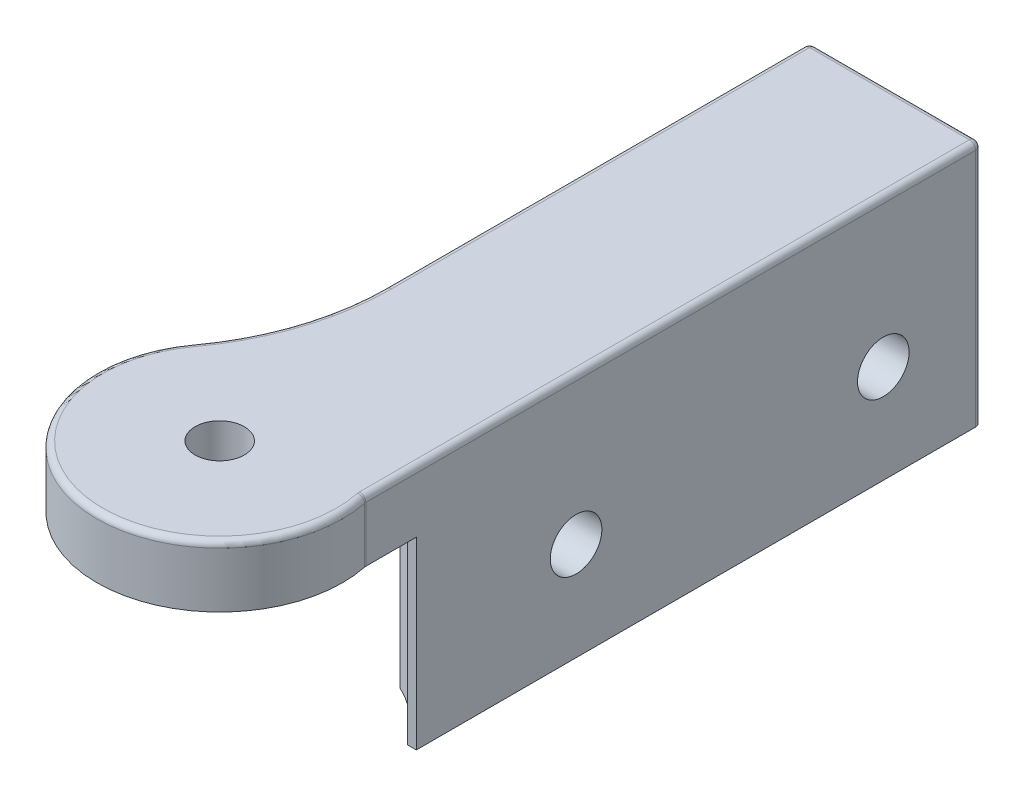
ISO-10303-21;
HEADER;
FILE_DESCRIPTION(('STEP AP214'),'2;1');
FILE_NAME('part.step','',(''),(''),'','','');
FILE_SCHEMA(('AUTOMOTIVE_DESIGN { 1 0 10303 214 1 1 1 1 }'));
ENDSEC;
DATA;
#1=APPLICATION_CONTEXT('core data for automotive mechanical design processes');
#2=APPLICATION_PROTOCOL_DEFINITION('international standard','automotive_design',2000,#1);
#3=PRODUCT_CONTEXT('',#1,'mechanical');
#4=PRODUCT('Part','Part','',(#3));
#5=PRODUCT_RELATED_PRODUCT_CATEGORY('part','',(#4));
#6=PRODUCT_DEFINITION_FORMATION('','',#4);
#7=PRODUCT_DEFINITION_CONTEXT('part definition',#1,'design');
#8=PRODUCT_DEFINITION('design','',#6,#7);
#9=PRODUCT_DEFINITION_SHAPE('','',#8);
#10=(LENGTH_UNIT() NAMED_UNIT(*) SI_UNIT(.MILLI.,.METRE.));
#11=(NAMED_UNIT(*) PLANE_ANGLE_UNIT() SI_UNIT($,.RADIAN.));
#12=(NAMED_UNIT(*) SI_UNIT($,.STERADIAN.) SOLID_ANGLE_UNIT());
#13=UNCERTAINTY_MEASURE_WITH_UNIT(LENGTH_MEASURE(1.E-05),#10,'distance_accuracy_value','');
#14=(GEOMETRIC_REPRESENTATION_CONTEXT(3) GLOBAL_UNCERTAINTY_ASSIGNED_CONTEXT((#13)) GLOBAL_UNIT_ASSIGNED_CONTEXT((#10,
#11,#12)) REPRESENTATION_CONTEXT('',''));
#15=CARTESIAN_POINT('',(0.,0.,0.));
#16=DIRECTION('',(0.,0.,1.));
#17=DIRECTION('',(1.,0.,0.));
#18=AXIS2_PLACEMENT_3D('',#15,#16,#17);
#19=CARTESIAN_POINT('',(31.,-46.2709412050371,15.));
#20=DIRECTION('',(0.,0.,-1.));
#21=DIRECTION('',(-1.,0.,0.));
#22=AXIS2_PLACEMENT_3D('',#19,#20,#21);
#23=PLANE('',#22);
#24=DIRECTION('',(0.,1.,0.));
#25=VECTOR('',#24,1.);
#26=CARTESIAN_POINT('',(30.2904333582046,-5.,15.));
#27=LINE('',#26,#25);
#28=CARTESIAN_POINT('',(30.2904333582046,0.,15.));
#29=VERTEX_POINT('',#28);
#30=CARTESIAN_POINT('',(30.2904333582046,15.,15.));
#31=VERTEX_POINT('',#30);
#32=EDGE_CURVE('E169',#29,#31,#27,.T.);
#33=ORIENTED_EDGE('',*,*,#32,.F.);
#34=DIRECTION('',(-1.,0.,0.));
#35=VECTOR('',#34,1.);
#36=CARTESIAN_POINT('',(31.,0.,15.));
#37=LINE('',#36,#35);
#38=CARTESIAN_POINT('',(31.,0.,15.));
#39=VERTEX_POINT('',#38);
#40=EDGE_CURVE('E748',#39,#29,#37,.T.);
#41=ORIENTED_EDGE('',*,*,#40,.F.);
#42=DIRECTION('',(0.,1.,0.));
#43=VECTOR('',#42,1.);
#44=CARTESIAN_POINT('',(31.,-46.2709412050371,15.));
#45=LINE('',#44,#43);
#46=CARTESIAN_POINT('',(31.,15.,15.));
#47=VERTEX_POINT('',#46);
#48=EDGE_CURVE('E373',#39,#47,#45,.T.);
#49=ORIENTED_EDGE('',*,*,#48,.T.);
#50=DIRECTION('',(-1.,0.,0.));
#51=VECTOR('',#50,1.);
#52=CARTESIAN_POINT('',(31.,15.,15.));
#53=LINE('',#52,#51);
#54=EDGE_CURVE('E379',#47,#31,#53,.T.);
#55=ORIENTED_EDGE('',*,*,#54,.T.);
#56=EDGE_LOOP('',(#33,#41,#49,#55));
#57=FACE_BOUND('',#56,.T.);
#58=ADVANCED_FACE('F44',(#57),#23,.F.);
#59=CARTESIAN_POINT('',(26.,-46.2709412050371,-31.));
#60=DIRECTION('',(1.,0.,0.));
#61=DIRECTION('',(0.,0.,-1.));
#62=AXIS2_PLACEMENT_3D('',#59,#60,#61);
#63=PLANE('',#62);
#64=CARTESIAN_POINT('',(26.,8.00000000000001,-23.));
#65=DIRECTION('',(1.,0.,0.));
#66=DIRECTION('',(0.,0.,-1.));
#67=AXIS2_PLACEMENT_3D('',#64,#65,#66);
#68=CIRCLE('',#67,2.1);
#69=CARTESIAN_POINT('',(26.,8.00000000000001,-25.1));
#70=VERTEX_POINT('',#69);
#71=EDGE_CURVE('E366',#70,#70,#68,.T.);
#72=ORIENTED_EDGE('',*,*,#71,.T.);
#73=EDGE_LOOP('',(#72));
#74=FACE_BOUND('',#73,.T.);
#75=CARTESIAN_POINT('',(26.,8.00000000000001,1.99999999999998));
#76=DIRECTION('',(1.,0.,0.));
#77=DIRECTION('',(0.,0.,-1.));
#78=AXIS2_PLACEMENT_3D('',#75,#76,#77);
#79=CIRCLE('',#78,2.1);
#80=CARTESIAN_POINT('',(26.,8.00000000000001,-0.100000000000025));
#81=VERTEX_POINT('',#80);
#82=EDGE_CURVE('E369',#81,#81,#79,.T.);
#83=ORIENTED_EDGE('',*,*,#82,.T.);
#84=EDGE_LOOP('',(#83));
#85=FACE_BOUND('',#84,.T.);
#86=DIRECTION('',(0.,0.,-1.));
#87=VECTOR('',#86,1.);
#88=CARTESIAN_POINT('',(26.,12.5,-31.));
#89=LINE('',#88,#87);
#90=CARTESIAN_POINT('',(26.,12.5,11.3093365821389));
#91=VERTEX_POINT('',#90);
#92=CARTESIAN_POINT('',(26.,12.5,-30.5));
#93=VERTEX_POINT('',#92);
#94=EDGE_CURVE('E183',#91,#93,#89,.T.);
#95=ORIENTED_EDGE('',*,*,#94,.T.);
#96=DIRECTION('',(0.,1.,0.));
#97=VECTOR('',#96,1.);
#98=CARTESIAN_POINT('',(26.,-46.2709412050371,-30.5));
#99=LINE('',#98,#97);
#100=CARTESIAN_POINT('',(26.,0.,-30.5));
#101=VERTEX_POINT('',#100);
#102=EDGE_CURVE('E262',#93,#101,#99,.F.);
#103=ORIENTED_EDGE('',*,*,#102,.T.);
#104=DIRECTION('',(0.,0.,-1.));
#105=VECTOR('',#104,1.);
#106=CARTESIAN_POINT('',(26.,0.,-31.));
#107=LINE('',#106,#105);
#108=CARTESIAN_POINT('',(26.,0.,11.3093365821389));
#109=VERTEX_POINT('',#108);
#110=EDGE_CURVE('E394',#109,#101,#107,.T.);
#111=ORIENTED_EDGE('',*,*,#110,.F.);
#112=DIRECTION('',(0.,1.,0.));
#113=VECTOR('',#112,1.);
#114=CARTESIAN_POINT('',(26.,-5.,11.3093365821389));
#115=LINE('',#114,#113);
#116=EDGE_CURVE('E175',#91,#109,#115,.F.);
#117=ORIENTED_EDGE('',*,*,#116,.F.);
#118=EDGE_LOOP('',(#95,#103,#111,#117));
#119=FACE_BOUND('',#118,.T.);
#120=ADVANCED_FACE('F445',(#74,#85,#119),#63,.F.);
#121=CARTESIAN_POINT('',(26.,12.5,-31.));
#122=DIRECTION('',(-0.70710678118655,-0.707106781186545,0.));
#123=DIRECTION('',(0.,0.,1.));
#124=AXIS2_PLACEMENT_3D('',#121,#122,#123);
#125=PLANE('',#124);
#126=CARTESIAN_POINT('',(21.2132034355964,17.2867965644036,21.2132034355964));
#127=DIRECTION('',(-0.70710678118655,-0.707106781186545,0.));
#128=DIRECTION('',(-0.707106781186545,0.70710678118655,0.));
#129=AXIS2_PLACEMENT_3D('',#126,#127,#128);
#130=ELLIPSE('',#129,15.5563491861041,11.);
#131=CARTESIAN_POINT('',(23.5,15.,10.4535305096645));
#132=VERTEX_POINT('',#131);
#133=EDGE_CURVE('E166',#132,#91,#130,.T.);
#134=ORIENTED_EDGE('',*,*,#133,.F.);
#135=DIRECTION('',(0.,0.,1.));
#136=VECTOR('',#135,1.);
#137=CARTESIAN_POINT('',(23.5,15.,15.));
#138=LINE('',#137,#136);
#139=CARTESIAN_POINT('',(23.5,15.,-31.));
#140=VERTEX_POINT('',#139);
#141=EDGE_CURVE('E181',#140,#132,#138,.T.);
#142=ORIENTED_EDGE('',*,*,#141,.F.);
#143=DIRECTION('',(0.707106781186545,-0.70710678118655,0.));
#144=VECTOR('',#143,1.);
#145=CARTESIAN_POINT('',(17.75,20.75,-31.0000000000001));
#146=LINE('',#145,#144);
#147=CARTESIAN_POINT('',(26.5,12.,-31.));
#148=VERTEX_POINT('',#147);
#149=EDGE_CURVE('E186',#148,#140,#146,.F.);
#150=ORIENTED_EDGE('',*,*,#149,.F.);
#151=CARTESIAN_POINT('',(26.5,12.,-30.5));
#152=DIRECTION('',(-0.70710678118655,-0.707106781186545,0.));
#153=DIRECTION('',(-0.707106781186545,0.70710678118655,0.));
#154=AXIS2_PLACEMENT_3D('',#151,#152,#153);
#155=ELLIPSE('',#154,0.70710678118655,0.5);
#156=EDGE_CURVE('E54',#148,#93,#155,.F.);
#157=ORIENTED_EDGE('',*,*,#156,.T.);
#158=ORIENTED_EDGE('',*,*,#94,.F.);
#159=EDGE_LOOP('',(#134,#142,#150,#157,#158));
#160=FACE_BOUND('',#159,.T.);
#161=ADVANCED_FACE('F180',(#160),#125,.T.);
#162=CARTESIAN_POINT('',(21.2132034355964,15.,21.2132034355964));
#163=DIRECTION('',(0.,1.,0.));
#164=DIRECTION('',(0.,0.,1.));
#165=AXIS2_PLACEMENT_3D('',#162,#163,#164);
#166=PLANE('',#165);
#167=DIRECTION('',(0.,0.,1.));
#168=VECTOR('',#167,1.);
#169=CARTESIAN_POINT('',(17.,15.,-31.0000000000001));
#170=LINE('',#169,#168);
#171=CARTESIAN_POINT('',(17.,15.,-30.5000000000001));
#172=VERTEX_POINT('',#171);
#173=CARTESIAN_POINT('',(17.,15.,3.50103870661928));
#174=VERTEX_POINT('',#173);
#175=EDGE_CURVE('E397',#172,#174,#170,.T.);
#176=ORIENTED_EDGE('',*,*,#175,.F.);
#177=CARTESIAN_POINT('',(17.5,15.,-30.5000000000001));
#178=DIRECTION('',(0.,1.,0.));
#179=DIRECTION('',(0.,0.,1.));
#180=AXIS2_PLACEMENT_3D('',#177,#178,#179);
#181=CIRCLE('',#180,0.5);
#182=CARTESIAN_POINT('',(17.5,15.,-31.0000000000001));
#183=VERTEX_POINT('',#182);
#184=EDGE_CURVE('E272',#172,#183,#181,.F.);
#185=ORIENTED_EDGE('',*,*,#184,.T.);
#186=DIRECTION('',(-1.,0.,0.));
#187=VECTOR('',#186,1.);
#188=CARTESIAN_POINT('',(17.,15.,-31.0000000000001));
#189=LINE('',#188,#187);
#190=EDGE_CURVE('E192',#140,#183,#189,.T.);
#191=ORIENTED_EDGE('',*,*,#190,.F.);
#192=ORIENTED_EDGE('',*,*,#141,.T.);
#193=CARTESIAN_POINT('',(21.2132034355964,15.,21.2132034355964));
#194=DIRECTION('',(0.,-1.,0.));
#195=DIRECTION('',(0.,0.,-1.));
#196=AXIS2_PLACEMENT_3D('',#193,#194,#195);
#197=CIRCLE('',#196,11.);
#198=EDGE_CURVE('E163',#132,#31,#197,.T.);
#199=ORIENTED_EDGE('',*,*,#198,.T.);
#200=ORIENTED_EDGE('',*,*,#54,.F.);
#201=DIRECTION('',(0.,0.,-1.));
#202=VECTOR('',#201,1.);
#203=CARTESIAN_POINT('',(31.,15.,19.1592771937419));
#204=LINE('',#203,#202);
#205=CARTESIAN_POINT('',(31.,15.,19.1080154528797));
#206=VERTEX_POINT('',#205);
#207=EDGE_CURVE('E351',#206,#47,#204,.T.);
#208=ORIENTED_EDGE('',*,*,#207,.F.);
#209=CARTESIAN_POINT('',(31.5,15.,19.1080154528797));
#210=DIRECTION('',(0.,1.,0.));
#211=DIRECTION('',(0.,0.,1.));
#212=AXIS2_PLACEMENT_3D('',#209,#210,#211);
#213=CIRCLE('',#212,0.5);
#214=CARTESIAN_POINT('',(31.0101525445522,15.,19.2082624996757));
#215=VERTEX_POINT('',#214);
#216=EDGE_CURVE('E11',#206,#215,#213,.T.);
#217=ORIENTED_EDGE('',*,*,#216,.T.);
#218=CARTESIAN_POINT('',(21.2132034355964,15.,21.2132034355964));
#219=DIRECTION('',(0.,1.,0.));
#220=DIRECTION('',(0.,0.,1.));
#221=AXIS2_PLACEMENT_3D('',#218,#219,#220);
#222=CIRCLE('',#221,10.);
#223=CARTESIAN_POINT('',(13.142135623731,15.,15.3091485259374));
#224=VERTEX_POINT('',#223);
#225=EDGE_CURVE('E357',#224,#215,#222,.T.);
#226=ORIENTED_EDGE('',*,*,#225,.F.);
#227=CARTESIAN_POINT('',(-3.,15.,3.50103870661927));
#228=DIRECTION('',(0.,-1.,0.));
#229=DIRECTION('',(0.,0.,-1.));
#230=AXIS2_PLACEMENT_3D('',#227,#228,#229);
#231=CIRCLE('',#230,20.);
#232=EDGE_CURVE('E348',#174,#224,#231,.T.);
#233=ORIENTED_EDGE('',*,*,#232,.F.);
#234=EDGE_LOOP('',(#176,#185,#191,#192,#199,#200,#208,#217,#226,#233));
#235=FACE_BOUND('',#234,.T.);
#236=CARTESIAN_POINT('',(21.2132034355964,15.,21.2132034355964));
#237=DIRECTION('',(0.,1.,0.));
#238=DIRECTION('',(0.,0.,1.));
#239=AXIS2_PLACEMENT_3D('',#236,#237,#238);
#240=CIRCLE('',#239,2.);
#241=CARTESIAN_POINT('',(21.2132034355964,15.,23.2132034355964));
#242=VERTEX_POINT('',#241);
#243=EDGE_CURVE('E361',#242,#242,#240,.T.);
#244=ORIENTED_EDGE('',*,*,#243,.T.);
#245=EDGE_LOOP('',(#244));
#246=FACE_BOUND('',#245,.T.);
#247=ADVANCED_FACE('F189',(#235,#246),#166,.F.);
#248=CARTESIAN_POINT('',(17.,20.,-31.0000000000001));
#249=DIRECTION('',(0.,0.,1.));
#250=DIRECTION('',(1.,0.,0.));
#251=AXIS2_PLACEMENT_3D('',#248,#249,#250);
#252=PLANE('',#251);
#253=DIRECTION('',(1.,0.,0.));
#254=VECTOR('',#253,1.);
#255=CARTESIAN_POINT('',(31.,0.,-31.));
#256=LINE('',#255,#254);
#257=CARTESIAN_POINT('',(26.5,0.,-31.));
#258=VERTEX_POINT('',#257);
#259=CARTESIAN_POINT('',(30.5,0.,-31.));
#260=VERTEX_POINT('',#259);
#261=EDGE_CURVE('E386',#258,#260,#256,.T.);
#262=ORIENTED_EDGE('',*,*,#261,.F.);
#263=DIRECTION('',(0.,1.,0.));
#264=VECTOR('',#263,1.);
#265=CARTESIAN_POINT('',(26.5,20.,-31.));
#266=LINE('',#265,#264);
#267=EDGE_CURVE('E240',#258,#148,#266,.T.);
#268=ORIENTED_EDGE('',*,*,#267,.T.);
#269=ORIENTED_EDGE('',*,*,#149,.T.);
#270=ORIENTED_EDGE('',*,*,#190,.T.);
#271=DIRECTION('',(0.,-1.,0.));
#272=VECTOR('',#271,1.);
#273=CARTESIAN_POINT('',(17.5,20.,-31.0000000000001));
#274=LINE('',#273,#272);
#275=CARTESIAN_POINT('',(17.5,19.5,-31.0000000000001));
#276=VERTEX_POINT('',#275);
#277=EDGE_CURVE('E233',#183,#276,#274,.F.);
#278=ORIENTED_EDGE('',*,*,#277,.T.);
#279=DIRECTION('',(-1.,0.,0.));
#280=VECTOR('',#279,1.);
#281=CARTESIAN_POINT('',(30.5,19.5,-31.));
#282=LINE('',#281,#280);
#283=CARTESIAN_POINT('',(30.5,19.5,-31.));
#284=VERTEX_POINT('',#283);
#285=EDGE_CURVE('E236',#276,#284,#282,.F.);
#286=ORIENTED_EDGE('',*,*,#285,.T.);
#287=DIRECTION('',(0.,-1.,0.));
#288=VECTOR('',#287,1.);
#289=CARTESIAN_POINT('',(30.5,20.,-31.));
#290=LINE('',#289,#288);
#291=EDGE_CURVE('E185',#284,#260,#290,.T.);
#292=ORIENTED_EDGE('',*,*,#291,.T.);
#293=EDGE_LOOP('',(#262,#268,#269,#270,#278,#286,#292));
#294=FACE_BOUND('',#293,.T.);
#295=ADVANCED_FACE('F421',(#294),#252,.F.);
#296=CARTESIAN_POINT('',(17.,20.,-31.0000000000001));
#297=DIRECTION('',(1.,0.,0.));
#298=DIRECTION('',(0.,0.,-1.));
#299=AXIS2_PLACEMENT_3D('',#296,#297,#298);
#300=PLANE('',#299);
#301=DIRECTION('',(0.,0.,1.));
#302=VECTOR('',#301,1.);
#303=CARTESIAN_POINT('',(17.,19.5,-31.0000000000001));
#304=LINE('',#303,#302);
#305=CARTESIAN_POINT('',(17.,19.5,3.50103870661927));
#306=VERTEX_POINT('',#305);
#307=CARTESIAN_POINT('',(17.,19.5,-30.5));
#308=VERTEX_POINT('',#307);
#309=EDGE_CURVE('E62',#306,#308,#304,.F.);
#310=ORIENTED_EDGE('',*,*,#309,.T.);
#311=DIRECTION('',(0.,-1.,0.));
#312=VECTOR('',#311,1.);
#313=CARTESIAN_POINT('',(17.,20.,-30.5));
#314=LINE('',#313,#312);
#315=EDGE_CURVE('E66',#308,#172,#314,.T.);
#316=ORIENTED_EDGE('',*,*,#315,.T.);
#317=ORIENTED_EDGE('',*,*,#175,.T.);
#318=DIRECTION('',(0.,-1.,0.));
#319=VECTOR('',#318,1.);
#320=CARTESIAN_POINT('',(17.,20.,3.50103870661927));
#321=LINE('',#320,#319);
#322=EDGE_CURVE('E199',#306,#174,#321,.T.);
#323=ORIENTED_EDGE('',*,*,#322,.F.);
#324=EDGE_LOOP('',(#310,#316,#317,#323));
#325=FACE_BOUND('',#324,.T.);
#326=ADVANCED_FACE('F474',(#325),#300,.F.);
#327=CARTESIAN_POINT('',(-3.,20.,3.50103870661927));
#328=DIRECTION('',(0.,-1.,0.));
#329=DIRECTION('',(0.,0.,-1.));
#330=AXIS2_PLACEMENT_3D('',#327,#328,#329);
#331=CYLINDRICAL_SURFACE('',#330,20.);
#332=DIRECTION('',(0.,-1.,0.));
#333=VECTOR('',#332,1.);
#334=CARTESIAN_POINT('',(13.142135623731,20.,15.3091485259374));
#335=LINE('',#334,#333);
#336=CARTESIAN_POINT('',(13.142135623731,19.5,15.3091485259374));
#337=VERTEX_POINT('',#336);
#338=EDGE_CURVE('E342',#337,#224,#335,.T.);
#339=ORIENTED_EDGE('',*,*,#338,.F.);
#340=CARTESIAN_POINT('',(-3.,19.5,3.50103870661927));
#341=DIRECTION('',(0.,1.,0.));
#342=DIRECTION('',(0.,0.,1.));
#343=AXIS2_PLACEMENT_3D('',#340,#341,#342);
#344=CIRCLE('',#343,20.);
#345=EDGE_CURVE('E259',#337,#306,#344,.T.);
#346=ORIENTED_EDGE('',*,*,#345,.T.);
#347=ORIENTED_EDGE('',*,*,#322,.T.);
#348=ORIENTED_EDGE('',*,*,#232,.T.);
#349=EDGE_LOOP('',(#339,#346,#347,#348));
#350=FACE_BOUND('',#349,.T.);
#351=ADVANCED_FACE('F345',(#350),#331,.F.);
#352=CARTESIAN_POINT('',(21.2132034355964,20.,21.2132034355964));
#353=DIRECTION('',(0.,-1.,0.));
#354=DIRECTION('',(0.,0.,-1.));
#355=AXIS2_PLACEMENT_3D('',#352,#353,#354);
#356=CYLINDRICAL_SURFACE('',#355,10.);
#357=DIRECTION('',(0.,-1.,0.));
#358=VECTOR('',#357,1.);
#359=CARTESIAN_POINT('',(31.0101525445522,20.,19.2082624996757));
#360=LINE('',#359,#358);
#361=CARTESIAN_POINT('',(31.0101525445522,19.5,19.2082624996757));
#362=VERTEX_POINT('',#361);
#363=EDGE_CURVE('E253',#215,#362,#360,.F.);
#364=ORIENTED_EDGE('',*,*,#363,.T.);
#365=CARTESIAN_POINT('',(21.2132034355964,19.5,21.2132034355964));
#366=DIRECTION('',(0.,1.,0.));
#367=DIRECTION('',(0.,0.,1.));
#368=AXIS2_PLACEMENT_3D('',#365,#366,#367);
#369=CIRCLE('',#368,10.);
#370=EDGE_CURVE('E256',#362,#337,#369,.F.);
#371=ORIENTED_EDGE('',*,*,#370,.T.);
#372=ORIENTED_EDGE('',*,*,#338,.T.);
#373=ORIENTED_EDGE('',*,*,#225,.T.);
#374=EDGE_LOOP('',(#364,#371,#372,#373));
#375=FACE_BOUND('',#374,.T.);
#376=ADVANCED_FACE('F340',(#375),#356,.T.);
#377=CARTESIAN_POINT('',(31.,20.,19.1592771937419));
#378=DIRECTION('',(-1.,0.,0.));
#379=DIRECTION('',(0.,0.,1.));
#380=AXIS2_PLACEMENT_3D('',#377,#378,#379);
#381=PLANE('',#380);
#382=CARTESIAN_POINT('',(31.,8.00000000000001,1.99999999999998));
#383=DIRECTION('',(1.,0.,0.));
#384=DIRECTION('',(0.,0.,-1.));
#385=AXIS2_PLACEMENT_3D('',#382,#383,#384);
#386=CIRCLE('',#385,2.1);
#387=CARTESIAN_POINT('',(31.,8.00000000000001,-0.100000000000025));
#388=VERTEX_POINT('',#387);
#389=EDGE_CURVE('E370',#388,#388,#386,.T.);
#390=ORIENTED_EDGE('',*,*,#389,.F.);
#391=EDGE_LOOP('',(#390));
#392=FACE_BOUND('',#391,.T.);
#393=CARTESIAN_POINT('',(31.,8.00000000000001,-23.));
#394=DIRECTION('',(1.,0.,0.));
#395=DIRECTION('',(0.,0.,-1.));
#396=AXIS2_PLACEMENT_3D('',#393,#394,#395);
#397=CIRCLE('',#396,2.1);
#398=CARTESIAN_POINT('',(31.,8.00000000000001,-25.1));
#399=VERTEX_POINT('',#398);
#400=EDGE_CURVE('E735',#399,#399,#397,.T.);
#401=ORIENTED_EDGE('',*,*,#400,.F.);
#402=EDGE_LOOP('',(#401));
#403=FACE_BOUND('',#402,.T.);
#404=DIRECTION('',(0.,-1.,0.));
#405=VECTOR('',#404,1.);
#406=CARTESIAN_POINT('',(31.,20.,-30.5));
#407=LINE('',#406,#405);
#408=CARTESIAN_POINT('',(31.,0.,-30.5));
#409=VERTEX_POINT('',#408);
#410=CARTESIAN_POINT('',(31.,19.5,-30.5));
#411=VERTEX_POINT('',#410);
#412=EDGE_CURVE('E209',#409,#411,#407,.F.);
#413=ORIENTED_EDGE('',*,*,#412,.T.);
#414=DIRECTION('',(0.,0.,-1.));
#415=VECTOR('',#414,1.);
#416=CARTESIAN_POINT('',(31.,19.5,19.1592771937419));
#417=LINE('',#416,#415);
#418=CARTESIAN_POINT('',(31.,19.5,19.1080154528797));
#419=VERTEX_POINT('',#418);
#420=EDGE_CURVE('E250',#411,#419,#417,.F.);
#421=ORIENTED_EDGE('',*,*,#420,.T.);
#422=DIRECTION('',(0.,1.,0.));
#423=VECTOR('',#422,1.);
#424=CARTESIAN_POINT('',(31.,15.,19.1080154528797));
#425=LINE('',#424,#423);
#426=EDGE_CURVE('E247',#419,#206,#425,.F.);
#427=ORIENTED_EDGE('',*,*,#426,.T.);
#428=ORIENTED_EDGE('',*,*,#207,.T.);
#429=ORIENTED_EDGE('',*,*,#48,.F.);
#430=DIRECTION('',(0.,0.,1.));
#431=VECTOR('',#430,1.);
#432=CARTESIAN_POINT('',(31.,0.,-31.));
#433=LINE('',#432,#431);
#434=EDGE_CURVE('E410',#409,#39,#433,.T.);
#435=ORIENTED_EDGE('',*,*,#434,.F.);
#436=EDGE_LOOP('',(#413,#421,#427,#428,#429,#435));
#437=FACE_BOUND('',#436,.T.);
#438=ADVANCED_FACE('F407',(#392,#403,#437),#381,.F.);
#439=CARTESIAN_POINT('',(21.2132034355964,20.,21.2132034355964));
#440=DIRECTION('',(0.,1.,0.));
#441=DIRECTION('',(0.,0.,1.));
#442=AXIS2_PLACEMENT_3D('',#439,#440,#441);
#443=PLANE('',#442);
#444=CARTESIAN_POINT('',(31.5,20.,19.1080154528797));
#445=DIRECTION('',(0.,1.,0.));
#446=DIRECTION('',(0.,0.,1.));
#447=AXIS2_PLACEMENT_3D('',#444,#445,#446);
#448=CIRCLE('',#447,1.);
#449=CARTESIAN_POINT('',(30.5,20.,19.1080154528797));
#450=VERTEX_POINT('',#449);
#451=CARTESIAN_POINT('',(30.5203050891044,20.,19.3085095464717));
#452=VERTEX_POINT('',#451);
#453=EDGE_CURVE('E226',#450,#452,#448,.T.);
#454=ORIENTED_EDGE('',*,*,#453,.F.);
#455=DIRECTION('',(0.,0.,-1.));
#456=VECTOR('',#455,1.);
#457=CARTESIAN_POINT('',(30.5,20.,-30.5));
#458=LINE('',#457,#456);
#459=CARTESIAN_POINT('',(30.5,20.,-30.5));
#460=VERTEX_POINT('',#459);
#461=EDGE_CURVE('E230',#450,#460,#458,.T.);
#462=ORIENTED_EDGE('',*,*,#461,.T.);
#463=DIRECTION('',(-1.,0.,0.));
#464=VECTOR('',#463,1.);
#465=CARTESIAN_POINT('',(17.,20.,-30.5));
#466=LINE('',#465,#464);
#467=CARTESIAN_POINT('',(17.5,20.,-30.5));
#468=VERTEX_POINT('',#467);
#469=EDGE_CURVE('E222',#460,#468,#466,.T.);
#470=ORIENTED_EDGE('',*,*,#469,.T.);
#471=DIRECTION('',(0.,0.,1.));
#472=VECTOR('',#471,1.);
#473=CARTESIAN_POINT('',(17.5,20.,3.50103870661927));
#474=LINE('',#473,#472);
#475=CARTESIAN_POINT('',(17.5,20.,3.50103870661927));
#476=VERTEX_POINT('',#475);
#477=EDGE_CURVE('E213',#468,#476,#474,.T.);
#478=ORIENTED_EDGE('',*,*,#477,.T.);
#479=CARTESIAN_POINT('',(-3.,20.,3.50103870661927));
#480=DIRECTION('',(0.,1.,0.));
#481=DIRECTION('',(0.,0.,1.));
#482=AXIS2_PLACEMENT_3D('',#479,#480,#481);
#483=CIRCLE('',#482,20.5);
#484=CARTESIAN_POINT('',(13.5456890143242,20.,15.6043512714203));
#485=VERTEX_POINT('',#484);
#486=EDGE_CURVE('E216',#476,#485,#483,.F.);
#487=ORIENTED_EDGE('',*,*,#486,.T.);
#488=CARTESIAN_POINT('',(21.2132034355964,20.,21.2132034355964));
#489=DIRECTION('',(0.,1.,0.));
#490=DIRECTION('',(0.,0.,1.));
#491=AXIS2_PLACEMENT_3D('',#488,#489,#490);
#492=CIRCLE('',#491,9.5);
#493=EDGE_CURVE('E219',#485,#452,#492,.T.);
#494=ORIENTED_EDGE('',*,*,#493,.T.);
#495=EDGE_LOOP('',(#454,#462,#470,#478,#487,#494));
#496=FACE_BOUND('',#495,.T.);
#497=CARTESIAN_POINT('',(21.2132034355964,20.,21.2132034355964));
#498=DIRECTION('',(0.,-1.,0.));
#499=DIRECTION('',(0.,0.,-1.));
#500=AXIS2_PLACEMENT_3D('',#497,#498,#499);
#501=CIRCLE('',#500,2.);
#502=CARTESIAN_POINT('',(21.2132034355964,20.,19.2132034355964));
#503=VERTEX_POINT('',#502);
#504=EDGE_CURVE('E365',#503,#503,#501,.T.);
#505=ORIENTED_EDGE('',*,*,#504,.T.);
#506=EDGE_LOOP('',(#505));
#507=FACE_BOUND('',#506,.T.);
#508=ADVANCED_FACE('F328',(#496,#507),#443,.T.);
#509=CARTESIAN_POINT('',(21.2132034355964,20.,21.2132034355964));
#510=DIRECTION('',(0.,-1.,0.));
#511=DIRECTION('',(0.,0.,-1.));
#512=AXIS2_PLACEMENT_3D('',#509,#510,#511);
#513=CYLINDRICAL_SURFACE('',#512,2.);
#514=ORIENTED_EDGE('',*,*,#504,.F.);
#515=EDGE_LOOP('',(#514));
#516=FACE_BOUND('',#515,.T.);
#517=ORIENTED_EDGE('',*,*,#243,.F.);
#518=EDGE_LOOP('',(#517));
#519=FACE_BOUND('',#518,.T.);
#520=ADVANCED_FACE('F458',(#516,#519),#513,.F.);
#521=CARTESIAN_POINT('',(21.2132034355964,0.,21.2132034355964));
#522=DIRECTION('',(0.,-1.,0.));
#523=DIRECTION('',(0.,0.,-1.));
#524=AXIS2_PLACEMENT_3D('',#521,#522,#523);
#525=PLANE('',#524);
#526=ORIENTED_EDGE('',*,*,#110,.T.);
#527=CARTESIAN_POINT('',(26.5,0.,-30.5));
#528=DIRECTION('',(0.,-1.,0.));
#529=DIRECTION('',(0.,0.,-1.));
#530=AXIS2_PLACEMENT_3D('',#527,#528,#529);
#531=CIRCLE('',#530,0.5);
#532=EDGE_CURVE('E265',#101,#258,#531,.T.);
#533=ORIENTED_EDGE('',*,*,#532,.T.);
#534=ORIENTED_EDGE('',*,*,#261,.T.);
#535=CARTESIAN_POINT('',(30.5,0.,-30.5));
#536=DIRECTION('',(0.,-1.,0.));
#537=DIRECTION('',(0.,0.,-1.));
#538=AXIS2_PLACEMENT_3D('',#535,#536,#537);
#539=CIRCLE('',#538,0.5);
#540=EDGE_CURVE('E206',#260,#409,#539,.T.);
#541=ORIENTED_EDGE('',*,*,#540,.T.);
#542=ORIENTED_EDGE('',*,*,#434,.T.);
#543=ORIENTED_EDGE('',*,*,#40,.T.);
#544=CARTESIAN_POINT('',(21.2132034355964,0.,21.2132034355964));
#545=DIRECTION('',(0.,-1.,0.));
#546=DIRECTION('',(0.,0.,-1.));
#547=AXIS2_PLACEMENT_3D('',#544,#545,#546);
#548=CIRCLE('',#547,11.);
#549=EDGE_CURVE('E763',#29,#109,#548,.F.);
#550=ORIENTED_EDGE('',*,*,#549,.T.);
#551=EDGE_LOOP('',(#526,#533,#534,#541,#542,#543,#550));
#552=FACE_BOUND('',#551,.T.);
#553=ADVANCED_FACE('F454',(#552),#525,.T.);
#554=CARTESIAN_POINT('',(-44.5477272147525,8.00000000000001,-23.));
#555=DIRECTION('',(1.,0.,0.));
#556=DIRECTION('',(0.,0.,-1.));
#557=AXIS2_PLACEMENT_3D('',#554,#555,#556);
#558=CYLINDRICAL_SURFACE('',#557,2.1);
#559=ORIENTED_EDGE('',*,*,#400,.T.);
#560=EDGE_LOOP('',(#559));
#561=FACE_BOUND('',#560,.T.);
#562=ORIENTED_EDGE('',*,*,#71,.F.);
#563=EDGE_LOOP('',(#562));
#564=FACE_BOUND('',#563,.T.);
#565=ADVANCED_FACE('F457',(#561,#564),#558,.F.);
#566=CARTESIAN_POINT('',(-44.5477272147525,8.00000000000001,1.99999999999997));
#567=DIRECTION('',(1.,0.,0.));
#568=DIRECTION('',(0.,0.,-1.));
#569=AXIS2_PLACEMENT_3D('',#566,#567,#568);
#570=CYLINDRICAL_SURFACE('',#569,2.1);
#571=ORIENTED_EDGE('',*,*,#389,.T.);
#572=EDGE_LOOP('',(#571));
#573=FACE_BOUND('',#572,.T.);
#574=ORIENTED_EDGE('',*,*,#82,.F.);
#575=EDGE_LOOP('',(#574));
#576=FACE_BOUND('',#575,.T.);
#577=ADVANCED_FACE('F602',(#573,#576),#570,.F.);
#578=CARTESIAN_POINT('',(21.2132034355964,-5.,21.2132034355964));
#579=DIRECTION('',(0.,1.,0.));
#580=DIRECTION('',(0.,0.,1.));
#581=AXIS2_PLACEMENT_3D('',#578,#579,#580);
#582=CYLINDRICAL_SURFACE('',#581,11.);
#583=ORIENTED_EDGE('',*,*,#32,.T.);
#584=ORIENTED_EDGE('',*,*,#198,.F.);
#585=ORIENTED_EDGE('',*,*,#133,.T.);
#586=ORIENTED_EDGE('',*,*,#116,.T.);
#587=ORIENTED_EDGE('',*,*,#549,.F.);
#588=EDGE_LOOP('',(#583,#584,#585,#586,#587));
#589=FACE_BOUND('',#588,.T.);
#590=ADVANCED_FACE('F165',(#589),#582,.F.);
#591=CARTESIAN_POINT('',(30.5,20.,-30.5));
#592=DIRECTION('',(0.,-1.,0.));
#593=DIRECTION('',(0.,0.,-1.));
#594=AXIS2_PLACEMENT_3D('',#591,#592,#593);
#595=CYLINDRICAL_SURFACE('',#594,0.5);
#596=ORIENTED_EDGE('',*,*,#291,.F.);
#597=CARTESIAN_POINT('',(30.5,19.5,-30.5));
#598=DIRECTION('',(0.,-1.,0.));
#599=DIRECTION('',(0.,0.,-1.));
#600=AXIS2_PLACEMENT_3D('',#597,#598,#599);
#601=CIRCLE('',#600,0.5);
#602=EDGE_CURVE('E244',#284,#411,#601,.T.);
#603=ORIENTED_EDGE('',*,*,#602,.T.);
#604=ORIENTED_EDGE('',*,*,#412,.F.);
#605=ORIENTED_EDGE('',*,*,#540,.F.);
#606=EDGE_LOOP('',(#596,#603,#604,#605));
#607=FACE_BOUND('',#606,.T.);
#608=ADVANCED_FACE('F414',(#607),#595,.T.);
#609=CARTESIAN_POINT('',(31.5,20.,19.1080154528797));
#610=DIRECTION('',(0.,-1.,0.));
#611=DIRECTION('',(0.,0.,-1.));
#612=AXIS2_PLACEMENT_3D('',#609,#610,#611);
#613=CYLINDRICAL_SURFACE('',#612,0.5);
#614=ORIENTED_EDGE('',*,*,#216,.F.);
#615=ORIENTED_EDGE('',*,*,#426,.F.);
#616=CARTESIAN_POINT('',(31.5,19.5,19.1080154528797));
#617=DIRECTION('',(0.,1.,0.));
#618=DIRECTION('',(0.,0.,1.));
#619=AXIS2_PLACEMENT_3D('',#616,#617,#618);
#620=CIRCLE('',#619,0.5);
#621=EDGE_CURVE('E48',#362,#419,#620,.F.);
#622=ORIENTED_EDGE('',*,*,#621,.F.);
#623=ORIENTED_EDGE('',*,*,#363,.F.);
#624=EDGE_LOOP('',(#614,#615,#622,#623));
#625=FACE_BOUND('',#624,.T.);
#626=ADVANCED_FACE('F404',(#625),#613,.F.);
#627=CARTESIAN_POINT('',(21.2132034355964,19.5,21.2132034355964));
#628=DIRECTION('',(0.,1.,0.));
#629=DIRECTION('',(0.,0.,1.));
#630=AXIS2_PLACEMENT_3D('',#627,#628,#629);
#631=TOROIDAL_SURFACE('',#630,9.5,0.5);
#632=CARTESIAN_POINT('',(13.5456890143242,19.5,15.6043512714203));
#633=DIRECTION('',(0.590405490965905,0.,-0.807106781186547));
#634=DIRECTION('',(-0.807106781186547,0.,-0.590405490965905));
#635=AXIS2_PLACEMENT_3D('',#632,#633,#634);
#636=CIRCLE('',#635,0.5);
#637=EDGE_CURVE('E303',#337,#485,#636,.T.);
#638=ORIENTED_EDGE('',*,*,#637,.F.);
#639=ORIENTED_EDGE('',*,*,#370,.F.);
#640=CARTESIAN_POINT('',(30.5203050891044,19.5,19.3085095464717));
#641=DIRECTION('',(-0.200494093592067,0.,-0.979694910895578));
#642=DIRECTION('',(-0.979694910895579,0.,0.200494093592067));
#643=AXIS2_PLACEMENT_3D('',#640,#641,#642);
#644=CIRCLE('',#643,0.5);
#645=EDGE_CURVE('E306',#452,#362,#644,.T.);
#646=ORIENTED_EDGE('',*,*,#645,.F.);
#647=ORIENTED_EDGE('',*,*,#493,.F.);
#648=EDGE_LOOP('',(#638,#639,#646,#647));
#649=FACE_BOUND('',#648,.T.);
#650=ADVANCED_FACE('F336',(#649),#631,.T.);
#651=CARTESIAN_POINT('',(31.5,19.5,19.1080154528797));
#652=DIRECTION('',(0.,1.,0.));
#653=DIRECTION('',(0.,0.,1.));
#654=AXIS2_PLACEMENT_3D('',#651,#652,#653);
#655=TOROIDAL_SURFACE('',#654,1.,0.5);
#656=ORIENTED_EDGE('',*,*,#645,.T.);
#657=ORIENTED_EDGE('',*,*,#621,.T.);
#658=CARTESIAN_POINT('',(30.5,19.5,19.1080154528797));
#659=DIRECTION('',(0.,0.,1.));
#660=DIRECTION('',(1.,0.,0.));
#661=AXIS2_PLACEMENT_3D('',#658,#659,#660);
#662=CIRCLE('',#661,0.5);
#663=EDGE_CURVE('E299',#450,#419,#662,.F.);
#664=ORIENTED_EDGE('',*,*,#663,.F.);
#665=ORIENTED_EDGE('',*,*,#453,.T.);
#666=EDGE_LOOP('',(#656,#657,#664,#665));
#667=FACE_BOUND('',#666,.T.);
#668=ADVANCED_FACE('F317',(#667),#655,.T.);
#669=CARTESIAN_POINT('',(-3.,19.5,3.50103870661927));
#670=DIRECTION('',(0.,1.,0.));
#671=DIRECTION('',(0.,0.,1.));
#672=AXIS2_PLACEMENT_3D('',#669,#670,#671);
#673=TOROIDAL_SURFACE('',#672,20.5,0.5);
#674=ORIENTED_EDGE('',*,*,#637,.T.);
#675=ORIENTED_EDGE('',*,*,#486,.F.);
#676=CARTESIAN_POINT('',(17.5,19.5,3.50103870661927));
#677=DIRECTION('',(0.,0.,-1.));
#678=DIRECTION('',(-1.,0.,0.));
#679=AXIS2_PLACEMENT_3D('',#676,#677,#678);
#680=CIRCLE('',#679,0.5);
#681=EDGE_CURVE('E295',#306,#476,#680,.T.);
#682=ORIENTED_EDGE('',*,*,#681,.F.);
#683=ORIENTED_EDGE('',*,*,#345,.F.);
#684=EDGE_LOOP('',(#674,#675,#682,#683));
#685=FACE_BOUND('',#684,.T.);
#686=ADVANCED_FACE('F435',(#685),#673,.T.);
#687=CARTESIAN_POINT('',(30.5,19.5,21.2132034355964));
#688=DIRECTION('',(0.,0.,1.));
#689=DIRECTION('',(1.,0.,0.));
#690=AXIS2_PLACEMENT_3D('',#687,#688,#689);
#691=CYLINDRICAL_SURFACE('',#690,0.5);
#692=ORIENTED_EDGE('',*,*,#663,.T.);
#693=ORIENTED_EDGE('',*,*,#420,.F.);
#694=CARTESIAN_POINT('',(30.5,19.5,-30.5));
#695=DIRECTION('',(0.,0.,-1.));
#696=DIRECTION('',(-1.,0.,0.));
#697=AXIS2_PLACEMENT_3D('',#694,#695,#696);
#698=CIRCLE('',#697,0.5);
#699=EDGE_CURVE('E291',#460,#411,#698,.T.);
#700=ORIENTED_EDGE('',*,*,#699,.F.);
#701=ORIENTED_EDGE('',*,*,#461,.F.);
#702=EDGE_LOOP('',(#692,#693,#700,#701));
#703=FACE_BOUND('',#702,.T.);
#704=ADVANCED_FACE('F324',(#703),#691,.T.);
#705=CARTESIAN_POINT('',(17.5,19.5,21.2132034355964));
#706=DIRECTION('',(0.,0.,-1.));
#707=DIRECTION('',(-1.,0.,0.));
#708=AXIS2_PLACEMENT_3D('',#705,#706,#707);
#709=CYLINDRICAL_SURFACE('',#708,0.5);
#710=ORIENTED_EDGE('',*,*,#681,.T.);
#711=ORIENTED_EDGE('',*,*,#477,.F.);
#712=CARTESIAN_POINT('',(17.5,19.5,-30.5));
#713=DIRECTION('',(0.,0.,-1.));
#714=DIRECTION('',(-1.,0.,0.));
#715=AXIS2_PLACEMENT_3D('',#712,#713,#714);
#716=CIRCLE('',#715,0.5);
#717=EDGE_CURVE('E287',#308,#468,#716,.T.);
#718=ORIENTED_EDGE('',*,*,#717,.F.);
#719=ORIENTED_EDGE('',*,*,#309,.F.);
#720=EDGE_LOOP('',(#710,#711,#718,#719));
#721=FACE_BOUND('',#720,.T.);
#722=ADVANCED_FACE('F432',(#721),#709,.T.);
#723=CARTESIAN_POINT('',(17.5,20.,-30.5));
#724=DIRECTION('',(0.,-1.,0.));
#725=DIRECTION('',(0.,0.,-1.));
#726=AXIS2_PLACEMENT_3D('',#723,#724,#725);
#727=CYLINDRICAL_SURFACE('',#726,0.5);
#728=ORIENTED_EDGE('',*,*,#184,.F.);
#729=ORIENTED_EDGE('',*,*,#315,.F.);
#730=CARTESIAN_POINT('',(17.5,19.5,-30.5));
#731=DIRECTION('',(0.,1.,0.));
#732=DIRECTION('',(0.,0.,1.));
#733=AXIS2_PLACEMENT_3D('',#730,#731,#732);
#734=CIRCLE('',#733,0.5);
#735=EDGE_CURVE('E283',#276,#308,#734,.T.);
#736=ORIENTED_EDGE('',*,*,#735,.F.);
#737=ORIENTED_EDGE('',*,*,#277,.F.);
#738=EDGE_LOOP('',(#728,#729,#736,#737));
#739=FACE_BOUND('',#738,.T.);
#740=ADVANCED_FACE('F492',(#739),#727,.T.);
#741=CARTESIAN_POINT('',(30.5,19.5,-30.5));
#742=DIRECTION('',(0.,1.,0.));
#743=DIRECTION('',(0.,0.,1.));
#744=AXIS2_PLACEMENT_3D('',#741,#742,#743);
#745=SPHERICAL_SURFACE('',#744,0.5);
#746=ORIENTED_EDGE('',*,*,#699,.T.);
#747=ORIENTED_EDGE('',*,*,#602,.F.);
#748=CARTESIAN_POINT('',(30.5,19.5,-30.5));
#749=DIRECTION('',(-1.,0.,0.));
#750=DIRECTION('',(0.,0.,1.));
#751=AXIS2_PLACEMENT_3D('',#748,#749,#750);
#752=CIRCLE('',#751,0.5);
#753=EDGE_CURVE('E280',#460,#284,#752,.T.);
#754=ORIENTED_EDGE('',*,*,#753,.F.);
#755=EDGE_LOOP('',(#746,#747,#754));
#756=FACE_BOUND('',#755,.T.);
#757=ADVANCED_FACE('F417',(#756),#745,.T.);
#758=CARTESIAN_POINT('',(17.5,19.5,-30.5));
#759=DIRECTION('',(-1.,0.,0.));
#760=DIRECTION('',(0.,0.,1.));
#761=AXIS2_PLACEMENT_3D('',#758,#759,#760);
#762=SPHERICAL_SURFACE('',#761,0.5);
#763=ORIENTED_EDGE('',*,*,#735,.T.);
#764=ORIENTED_EDGE('',*,*,#717,.T.);
#765=CARTESIAN_POINT('',(17.5,19.5,-30.5));
#766=DIRECTION('',(-1.,0.,0.));
#767=DIRECTION('',(0.,0.,1.));
#768=AXIS2_PLACEMENT_3D('',#765,#766,#767);
#769=CIRCLE('',#768,0.5);
#770=EDGE_CURVE('E277',#276,#468,#769,.F.);
#771=ORIENTED_EDGE('',*,*,#770,.F.);
#772=EDGE_LOOP('',(#763,#764,#771));
#773=FACE_BOUND('',#772,.T.);
#774=ADVANCED_FACE('F428',(#773),#762,.T.);
#775=CARTESIAN_POINT('',(21.2132034355964,19.5,-30.5));
#776=DIRECTION('',(1.,0.,0.));
#777=DIRECTION('',(0.,0.,-1.));
#778=AXIS2_PLACEMENT_3D('',#775,#776,#777);
#779=CYLINDRICAL_SURFACE('',#778,0.5);
#780=ORIENTED_EDGE('',*,*,#753,.T.);
#781=ORIENTED_EDGE('',*,*,#285,.F.);
#782=ORIENTED_EDGE('',*,*,#770,.T.);
#783=ORIENTED_EDGE('',*,*,#469,.F.);
#784=EDGE_LOOP('',(#780,#781,#782,#783));
#785=FACE_BOUND('',#784,.T.);
#786=ADVANCED_FACE('F426',(#785),#779,.T.);
#787=CARTESIAN_POINT('',(26.5,20.,-30.5));
#788=DIRECTION('',(0.,1.,0.));
#789=DIRECTION('',(0.,0.,1.));
#790=AXIS2_PLACEMENT_3D('',#787,#788,#789);
#791=CYLINDRICAL_SURFACE('',#790,0.5);
#792=ORIENTED_EDGE('',*,*,#532,.F.);
#793=ORIENTED_EDGE('',*,*,#102,.F.);
#794=ORIENTED_EDGE('',*,*,#156,.F.);
#795=ORIENTED_EDGE('',*,*,#267,.F.);
#796=EDGE_LOOP('',(#792,#793,#794,#795));
#797=FACE_BOUND('',#796,.T.);
#798=ADVANCED_FACE('F46',(#797),#791,.T.);
#799=CLOSED_SHELL('',(#58,#120,#161,#247,#295,#326,#351,#376,#438,#508,#520,#553,#565,#577,#590,
#608,#626,#650,#668,#686,#704,#722,#740,#757,#774,#786,#798));
#800=MANIFOLD_SOLID_BREP('B2',#799);
#801=ADVANCED_BREP_SHAPE_REPRESENTATION('',(#18,#800),#14);
#802=SHAPE_DEFINITION_REPRESENTATION(#9,#801);
ENDSEC;
END-ISO-10303-21;
